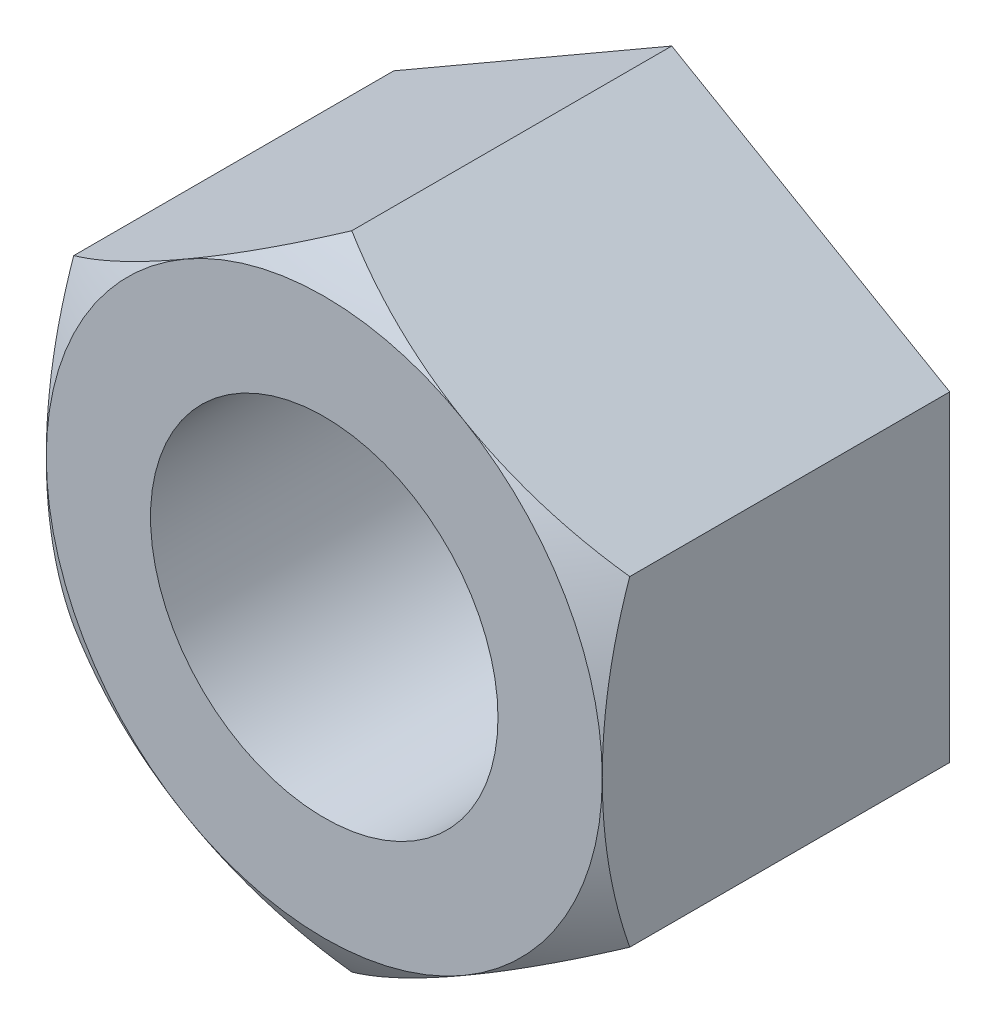
ISO-10303-21;
HEADER;
FILE_DESCRIPTION(('STEP AP214'),'2;1');
FILE_NAME('part.step','',(''),(''),'','','');
FILE_SCHEMA(('AUTOMOTIVE_DESIGN { 1 0 10303 214 1 1 1 1 }'));
ENDSEC;
DATA;
#1=APPLICATION_CONTEXT('core data for automotive mechanical design processes');
#2=APPLICATION_PROTOCOL_DEFINITION('international standard','automotive_design',2000,#1);
#3=PRODUCT_CONTEXT('',#1,'mechanical');
#4=PRODUCT('Part','Part','',(#3));
#5=PRODUCT_RELATED_PRODUCT_CATEGORY('part','',(#4));
#6=PRODUCT_DEFINITION_FORMATION('','',#4);
#7=PRODUCT_DEFINITION_CONTEXT('part definition',#1,'design');
#8=PRODUCT_DEFINITION('design','',#6,#7);
#9=PRODUCT_DEFINITION_SHAPE('','',#8);
#10=(LENGTH_UNIT() NAMED_UNIT(*) SI_UNIT(.MILLI.,.METRE.));
#11=(NAMED_UNIT(*) PLANE_ANGLE_UNIT() SI_UNIT($,.RADIAN.));
#12=(NAMED_UNIT(*) SI_UNIT($,.STERADIAN.) SOLID_ANGLE_UNIT());
#13=UNCERTAINTY_MEASURE_WITH_UNIT(LENGTH_MEASURE(1.E-05),#10,'distance_accuracy_value','');
#14=(GEOMETRIC_REPRESENTATION_CONTEXT(3) GLOBAL_UNCERTAINTY_ASSIGNED_CONTEXT((#13)) GLOBAL_UNIT_ASSIGNED_CONTEXT((#10,
#11,#12)) REPRESENTATION_CONTEXT('',''));
#15=CARTESIAN_POINT('',(0.,0.,0.));
#16=DIRECTION('',(0.,0.,1.));
#17=DIRECTION('',(1.,0.,0.));
#18=AXIS2_PLACEMENT_3D('',#15,#16,#17);
#19=CARTESIAN_POINT('',(0.,0.,5.));
#20=DIRECTION('',(0.,0.,1.));
#21=DIRECTION('',(1.,0.,0.));
#22=AXIS2_PLACEMENT_3D('',#19,#20,#21);
#23=PLANE('',#22);
#24=CARTESIAN_POINT('',(0.,0.,4.99999999999998));
#25=DIRECTION('',(0.,0.,-1.));
#26=DIRECTION('',(0.,1.,0.));
#27=AXIS2_PLACEMENT_3D('',#24,#25,#26);
#28=CIRCLE('',#27,4.);
#29=CARTESIAN_POINT('',(4.,0.,4.99999999999998));
#30=VERTEX_POINT('',#29);
#31=CARTESIAN_POINT('',(2.,-3.46410161513776,4.99999999999996));
#32=VERTEX_POINT('',#31);
#33=EDGE_CURVE('E177',#30,#32,#28,.T.);
#34=ORIENTED_EDGE('',*,*,#33,.F.);
#35=CARTESIAN_POINT('',(2.,3.46410161513776,5.));
#36=VERTEX_POINT('',#35);
#37=EDGE_CURVE('E175',#36,#30,#28,.T.);
#38=ORIENTED_EDGE('',*,*,#37,.F.);
#39=CARTESIAN_POINT('',(-2.,3.46410161513776,5.));
#40=VERTEX_POINT('',#39);
#41=EDGE_CURVE('E111',#40,#36,#28,.T.);
#42=ORIENTED_EDGE('',*,*,#41,.F.);
#43=CARTESIAN_POINT('',(-4.,0.,4.99999999999998));
#44=VERTEX_POINT('',#43);
#45=EDGE_CURVE('E49',#44,#40,#28,.T.);
#46=ORIENTED_EDGE('',*,*,#45,.F.);
#47=CARTESIAN_POINT('',(-2.,-3.46410161513776,4.99999999999996));
#48=VERTEX_POINT('',#47);
#49=EDGE_CURVE('E57',#48,#44,#28,.T.);
#50=ORIENTED_EDGE('',*,*,#49,.F.);
#51=EDGE_CURVE('E179',#32,#48,#28,.T.);
#52=ORIENTED_EDGE('',*,*,#51,.F.);
#53=EDGE_LOOP('',(#34,#38,#42,#46,#50,#52));
#54=FACE_BOUND('',#53,.T.);
#55=CARTESIAN_POINT('',(0.,0.,5.));
#56=DIRECTION('',(0.,0.,1.));
#57=DIRECTION('',(1.,0.,0.));
#58=AXIS2_PLACEMENT_3D('',#55,#56,#57);
#59=CIRCLE('',#58,2.5);
#60=CARTESIAN_POINT('',(2.5,0.,5.));
#61=VERTEX_POINT('',#60);
#62=EDGE_CURVE('E159',#61,#61,#59,.T.);
#63=ORIENTED_EDGE('',*,*,#62,.F.);
#64=EDGE_LOOP('',(#63));
#65=FACE_BOUND('',#64,.T.);
#66=ADVANCED_FACE('F34',(#54,#65),#23,.T.);
#67=CARTESIAN_POINT('',(0.,0.,0.));
#68=DIRECTION('',(0.,0.,1.));
#69=DIRECTION('',(1.,0.,0.));
#70=AXIS2_PLACEMENT_3D('',#67,#68,#69);
#71=PLANE('',#70);
#72=DIRECTION('',(-0.866025403784439,0.5,0.));
#73=VECTOR('',#72,1.);
#74=CARTESIAN_POINT('',(4.,2.30940107675851,0.));
#75=LINE('',#74,#73);
#76=CARTESIAN_POINT('',(4.,2.30940107675851,0.));
#77=VERTEX_POINT('',#76);
#78=CARTESIAN_POINT('',(0.,4.61880215351701,0.));
#79=VERTEX_POINT('',#78);
#80=EDGE_CURVE('E131',#77,#79,#75,.T.);
#81=ORIENTED_EDGE('',*,*,#80,.F.);
#82=DIRECTION('',(0.,1.,0.));
#83=VECTOR('',#82,1.);
#84=CARTESIAN_POINT('',(4.,-2.3094010767585,0.));
#85=LINE('',#84,#83);
#86=CARTESIAN_POINT('',(4.,-2.3094010767585,0.));
#87=VERTEX_POINT('',#86);
#88=EDGE_CURVE('E144',#87,#77,#85,.T.);
#89=ORIENTED_EDGE('',*,*,#88,.F.);
#90=DIRECTION('',(0.866025403784439,0.5,0.));
#91=VECTOR('',#90,1.);
#92=CARTESIAN_POINT('',(0.,-4.61880215351701,0.));
#93=LINE('',#92,#91);
#94=CARTESIAN_POINT('',(0.,-4.61880215351701,0.));
#95=VERTEX_POINT('',#94);
#96=EDGE_CURVE('E147',#95,#87,#93,.T.);
#97=ORIENTED_EDGE('',*,*,#96,.F.);
#98=DIRECTION('',(0.866025403784439,-0.5,0.));
#99=VECTOR('',#98,1.);
#100=CARTESIAN_POINT('',(-4.,-2.3094010767585,0.));
#101=LINE('',#100,#99);
#102=CARTESIAN_POINT('',(-4.,-2.3094010767585,0.));
#103=VERTEX_POINT('',#102);
#104=EDGE_CURVE('E150',#103,#95,#101,.T.);
#105=ORIENTED_EDGE('',*,*,#104,.F.);
#106=DIRECTION('',(0.,-1.,0.));
#107=VECTOR('',#106,1.);
#108=CARTESIAN_POINT('',(-4.,2.30940107675851,0.));
#109=LINE('',#108,#107);
#110=CARTESIAN_POINT('',(-4.,2.30940107675851,0.));
#111=VERTEX_POINT('',#110);
#112=EDGE_CURVE('E153',#111,#103,#109,.T.);
#113=ORIENTED_EDGE('',*,*,#112,.F.);
#114=DIRECTION('',(-0.866025403784439,-0.5,0.));
#115=VECTOR('',#114,1.);
#116=CARTESIAN_POINT('',(0.,4.61880215351701,0.));
#117=LINE('',#116,#115);
#118=EDGE_CURVE('E156',#79,#111,#117,.T.);
#119=ORIENTED_EDGE('',*,*,#118,.F.);
#120=EDGE_LOOP('',(#81,#89,#97,#105,#113,#119));
#121=FACE_BOUND('',#120,.T.);
#122=CARTESIAN_POINT('',(0.,0.,0.));
#123=DIRECTION('',(0.,0.,1.));
#124=DIRECTION('',(1.,0.,0.));
#125=AXIS2_PLACEMENT_3D('',#122,#123,#124);
#126=CIRCLE('',#125,2.5);
#127=CARTESIAN_POINT('',(2.5,0.,0.));
#128=VERTEX_POINT('',#127);
#129=EDGE_CURVE('E160',#128,#128,#126,.T.);
#130=ORIENTED_EDGE('',*,*,#129,.T.);
#131=EDGE_LOOP('',(#130));
#132=FACE_BOUND('',#131,.T.);
#133=ADVANCED_FACE('F207',(#121,#132),#71,.F.);
#134=CARTESIAN_POINT('',(4.,2.30940107675851,5.));
#135=DIRECTION('',(-0.5,-0.866025403784439,0.));
#136=DIRECTION('',(0.866025403784439,-0.5,0.));
#137=AXIS2_PLACEMENT_3D('',#134,#135,#136);
#138=PLANE('',#137);
#139=DIRECTION('',(0.,0.,-1.));
#140=VECTOR('',#139,1.);
#141=CARTESIAN_POINT('',(0.,4.61880215351701,5.));
#142=LINE('',#141,#140);
#143=CARTESIAN_POINT('',(0.,4.61880215351701,4.6037694171463));
#144=VERTEX_POINT('',#143);
#145=EDGE_CURVE('E124',#144,#79,#142,.T.);
#146=ORIENTED_EDGE('',*,*,#145,.F.);
#147=CARTESIAN_POINT('',(2.,3.46410161513776,-1.92820323027561));
#148=DIRECTION('',(-0.5,-0.866025403784439,0.));
#149=DIRECTION('',(0.866025403784439,-0.5,0.));
#150=AXIS2_PLACEMENT_3D('',#147,#148,#149);
#151=CIRCLE('',#150,6.92820323027561);
#152=EDGE_CURVE('E105',#144,#36,#151,.F.);
#153=ORIENTED_EDGE('',*,*,#152,.T.);
#154=CARTESIAN_POINT('',(4.,2.30940107675851,4.60376941714629));
#155=VERTEX_POINT('',#154);
#156=EDGE_CURVE('E118',#36,#155,#151,.F.);
#157=ORIENTED_EDGE('',*,*,#156,.T.);
#158=DIRECTION('',(0.,0.,-1.));
#159=VECTOR('',#158,1.);
#160=CARTESIAN_POINT('',(4.,2.30940107675851,5.));
#161=LINE('',#160,#159);
#162=EDGE_CURVE('E142',#155,#77,#161,.T.);
#163=ORIENTED_EDGE('',*,*,#162,.T.);
#164=ORIENTED_EDGE('',*,*,#80,.T.);
#165=EDGE_LOOP('',(#146,#153,#157,#163,#164));
#166=FACE_BOUND('',#165,.T.);
#167=ADVANCED_FACE('F36',(#166),#138,.F.);
#168=CARTESIAN_POINT('',(0.,4.61880215351701,5.));
#169=DIRECTION('',(0.5,-0.866025403784439,0.));
#170=DIRECTION('',(0.866025403784439,0.5,0.));
#171=AXIS2_PLACEMENT_3D('',#168,#169,#170);
#172=PLANE('',#171);
#173=DIRECTION('',(0.,0.,-1.));
#174=VECTOR('',#173,1.);
#175=CARTESIAN_POINT('',(-4.,2.30940107675851,5.));
#176=LINE('',#175,#174);
#177=CARTESIAN_POINT('',(-4.,2.3094010767585,4.60376941714629));
#178=VERTEX_POINT('',#177);
#179=EDGE_CURVE('E132',#178,#111,#176,.T.);
#180=ORIENTED_EDGE('',*,*,#179,.F.);
#181=CARTESIAN_POINT('',(-2.,3.46410161513776,-1.92820323027561));
#182=DIRECTION('',(0.5,-0.866025403784439,0.));
#183=DIRECTION('',(0.866025403784439,0.5,0.));
#184=AXIS2_PLACEMENT_3D('',#181,#182,#183);
#185=CIRCLE('',#184,6.92820323027561);
#186=EDGE_CURVE('E126',#178,#40,#185,.F.);
#187=ORIENTED_EDGE('',*,*,#186,.T.);
#188=EDGE_CURVE('E108',#40,#144,#185,.F.);
#189=ORIENTED_EDGE('',*,*,#188,.T.);
#190=ORIENTED_EDGE('',*,*,#145,.T.);
#191=ORIENTED_EDGE('',*,*,#118,.T.);
#192=EDGE_LOOP('',(#180,#187,#189,#190,#191));
#193=FACE_BOUND('',#192,.T.);
#194=ADVANCED_FACE('F122',(#193),#172,.F.);
#195=CARTESIAN_POINT('',(-4.,2.30940107675851,5.));
#196=DIRECTION('',(1.,0.,0.));
#197=DIRECTION('',(0.,1.,0.));
#198=AXIS2_PLACEMENT_3D('',#195,#196,#197);
#199=PLANE('',#198);
#200=DIRECTION('',(0.,0.,-1.));
#201=VECTOR('',#200,1.);
#202=CARTESIAN_POINT('',(-4.,-2.3094010767585,5.));
#203=LINE('',#202,#201);
#204=CARTESIAN_POINT('',(-3.99999999999998,-2.30940107675855,4.60376941714626));
#205=VERTEX_POINT('',#204);
#206=EDGE_CURVE('E134',#205,#103,#203,.T.);
#207=ORIENTED_EDGE('',*,*,#206,.F.);
#208=CARTESIAN_POINT('',(-4.,0.,-1.92820323027561));
#209=DIRECTION('',(1.,0.,0.));
#210=DIRECTION('',(0.,1.,0.));
#211=AXIS2_PLACEMENT_3D('',#208,#209,#210);
#212=CIRCLE('',#211,6.92820323027561);
#213=EDGE_CURVE('E163',#205,#44,#212,.F.);
#214=ORIENTED_EDGE('',*,*,#213,.T.);
#215=EDGE_CURVE('E166',#44,#178,#212,.F.);
#216=ORIENTED_EDGE('',*,*,#215,.T.);
#217=ORIENTED_EDGE('',*,*,#179,.T.);
#218=ORIENTED_EDGE('',*,*,#112,.T.);
#219=EDGE_LOOP('',(#207,#214,#216,#217,#218));
#220=FACE_BOUND('',#219,.T.);
#221=ADVANCED_FACE('F233',(#220),#199,.F.);
#222=CARTESIAN_POINT('',(-4.,-2.3094010767585,5.));
#223=DIRECTION('',(0.5,0.866025403784439,0.));
#224=DIRECTION('',(-0.866025403784439,0.5,0.));
#225=AXIS2_PLACEMENT_3D('',#222,#223,#224);
#226=PLANE('',#225);
#227=DIRECTION('',(0.,0.,-1.));
#228=VECTOR('',#227,1.);
#229=CARTESIAN_POINT('',(0.,-4.61880215351701,5.));
#230=LINE('',#229,#228);
#231=CARTESIAN_POINT('',(0.,-4.61880215351701,4.60376941714625));
#232=VERTEX_POINT('',#231);
#233=EDGE_CURVE('E138',#232,#95,#230,.T.);
#234=ORIENTED_EDGE('',*,*,#233,.F.);
#235=CARTESIAN_POINT('',(-2.,-3.46410161513775,-1.92820323027561));
#236=DIRECTION('',(0.5,0.866025403784439,0.));
#237=DIRECTION('',(-0.866025403784439,0.5,0.));
#238=AXIS2_PLACEMENT_3D('',#235,#236,#237);
#239=CIRCLE('',#238,6.92820323027561);
#240=EDGE_CURVE('E127',#232,#48,#239,.F.);
#241=ORIENTED_EDGE('',*,*,#240,.T.);
#242=EDGE_CURVE('E168',#48,#205,#239,.F.);
#243=ORIENTED_EDGE('',*,*,#242,.T.);
#244=ORIENTED_EDGE('',*,*,#206,.T.);
#245=ORIENTED_EDGE('',*,*,#104,.T.);
#246=EDGE_LOOP('',(#234,#241,#243,#244,#245));
#247=FACE_BOUND('',#246,.T.);
#248=ADVANCED_FACE('F193',(#247),#226,.F.);
#249=CARTESIAN_POINT('',(0.,-4.61880215351701,5.));
#250=DIRECTION('',(-0.5,0.866025403784439,0.));
#251=DIRECTION('',(-0.866025403784439,-0.5,0.));
#252=AXIS2_PLACEMENT_3D('',#249,#250,#251);
#253=PLANE('',#252);
#254=DIRECTION('',(0.,0.,-1.));
#255=VECTOR('',#254,1.);
#256=CARTESIAN_POINT('',(4.,-2.3094010767585,5.));
#257=LINE('',#256,#255);
#258=CARTESIAN_POINT('',(4.,-2.30940107675851,4.60376941714626));
#259=VERTEX_POINT('',#258);
#260=EDGE_CURVE('E140',#259,#87,#257,.T.);
#261=ORIENTED_EDGE('',*,*,#260,.F.);
#262=CARTESIAN_POINT('',(2.,-3.46410161513776,-1.92820323027561));
#263=DIRECTION('',(-0.5,0.866025403784439,0.));
#264=DIRECTION('',(-0.866025403784439,-0.5,0.));
#265=AXIS2_PLACEMENT_3D('',#262,#263,#264);
#266=CIRCLE('',#265,6.92820323027561);
#267=EDGE_CURVE('E172',#259,#32,#266,.F.);
#268=ORIENTED_EDGE('',*,*,#267,.T.);
#269=EDGE_CURVE('E117',#32,#232,#266,.F.);
#270=ORIENTED_EDGE('',*,*,#269,.T.);
#271=ORIENTED_EDGE('',*,*,#233,.T.);
#272=ORIENTED_EDGE('',*,*,#96,.T.);
#273=EDGE_LOOP('',(#261,#268,#270,#271,#272));
#274=FACE_BOUND('',#273,.T.);
#275=ADVANCED_FACE('F202',(#274),#253,.F.);
#276=CARTESIAN_POINT('',(4.,-2.3094010767585,5.));
#277=DIRECTION('',(-1.,0.,0.));
#278=DIRECTION('',(0.,0.,1.));
#279=AXIS2_PLACEMENT_3D('',#276,#277,#278);
#280=PLANE('',#279);
#281=CARTESIAN_POINT('',(4.,0.,-1.92820323027561));
#282=DIRECTION('',(-1.,0.,0.));
#283=DIRECTION('',(0.,0.,1.));
#284=AXIS2_PLACEMENT_3D('',#281,#282,#283);
#285=CIRCLE('',#284,6.92820323027561);
#286=EDGE_CURVE('E38',#155,#30,#285,.F.);
#287=ORIENTED_EDGE('',*,*,#286,.T.);
#288=EDGE_CURVE('E11',#30,#259,#285,.F.);
#289=ORIENTED_EDGE('',*,*,#288,.T.);
#290=ORIENTED_EDGE('',*,*,#260,.T.);
#291=ORIENTED_EDGE('',*,*,#88,.T.);
#292=ORIENTED_EDGE('',*,*,#162,.F.);
#293=EDGE_LOOP('',(#287,#289,#290,#291,#292));
#294=FACE_BOUND('',#293,.T.);
#295=ADVANCED_FACE('F199',(#294),#280,.F.);
#296=CARTESIAN_POINT('',(0.,0.,5.));
#297=DIRECTION('',(0.,0.,-1.));
#298=DIRECTION('',(-1.,0.,0.));
#299=AXIS2_PLACEMENT_3D('',#296,#297,#298);
#300=CYLINDRICAL_SURFACE('',#299,2.5);
#301=ORIENTED_EDGE('',*,*,#62,.T.);
#302=EDGE_LOOP('',(#301));
#303=FACE_BOUND('',#302,.T.);
#304=ORIENTED_EDGE('',*,*,#129,.F.);
#305=EDGE_LOOP('',(#304));
#306=FACE_BOUND('',#305,.T.);
#307=ADVANCED_FACE('F211',(#303,#306),#300,.F.);
#308=CARTESIAN_POINT('',(0.,0.,-1.92820323027561));
#309=DIRECTION('',(0.,0.,-1.));
#310=DIRECTION('',(0.,1.,0.));
#311=AXIS2_PLACEMENT_3D('',#308,#309,#310);
#312=SPHERICAL_SURFACE('',#311,8.00000000000009);
#313=ORIENTED_EDGE('',*,*,#37,.T.);
#314=ORIENTED_EDGE('',*,*,#286,.F.);
#315=ORIENTED_EDGE('',*,*,#156,.F.);
#316=EDGE_LOOP('',(#313,#314,#315));
#317=FACE_BOUND('',#316,.T.);
#318=ADVANCED_FACE('F209',(#317),#312,.T.);
#319=ORIENTED_EDGE('',*,*,#288,.F.);
#320=ORIENTED_EDGE('',*,*,#33,.T.);
#321=ORIENTED_EDGE('',*,*,#267,.F.);
#322=EDGE_LOOP('',(#319,#320,#321));
#323=FACE_BOUND('',#322,.T.);
#324=ADVANCED_FACE('F196',(#323),#312,.T.);
#325=ORIENTED_EDGE('',*,*,#269,.F.);
#326=ORIENTED_EDGE('',*,*,#51,.T.);
#327=ORIENTED_EDGE('',*,*,#240,.F.);
#328=EDGE_LOOP('',(#325,#326,#327));
#329=FACE_BOUND('',#328,.T.);
#330=ADVANCED_FACE('F183',(#329),#312,.T.);
#331=ORIENTED_EDGE('',*,*,#242,.F.);
#332=ORIENTED_EDGE('',*,*,#49,.T.);
#333=ORIENTED_EDGE('',*,*,#213,.F.);
#334=EDGE_LOOP('',(#331,#332,#333));
#335=FACE_BOUND('',#334,.T.);
#336=ADVANCED_FACE('F188',(#335),#312,.T.);
#337=ORIENTED_EDGE('',*,*,#45,.T.);
#338=ORIENTED_EDGE('',*,*,#186,.F.);
#339=ORIENTED_EDGE('',*,*,#215,.F.);
#340=EDGE_LOOP('',(#337,#338,#339));
#341=FACE_BOUND('',#340,.T.);
#342=ADVANCED_FACE('F311',(#341),#312,.T.);
#343=ORIENTED_EDGE('',*,*,#41,.T.);
#344=ORIENTED_EDGE('',*,*,#152,.F.);
#345=ORIENTED_EDGE('',*,*,#188,.F.);
#346=EDGE_LOOP('',(#343,#344,#345));
#347=FACE_BOUND('',#346,.T.);
#348=ADVANCED_FACE('F107',(#347),#312,.T.);
#349=CLOSED_SHELL('',(#66,#133,#167,#194,#221,#248,#275,#295,#307,#318,#324,#330,#336,#342,#348));
#350=MANIFOLD_SOLID_BREP('B2',#349);
#351=ADVANCED_BREP_SHAPE_REPRESENTATION('',(#18,#350),#14);
#352=SHAPE_DEFINITION_REPRESENTATION(#9,#351);
ENDSEC;
END-ISO-10303-21;
